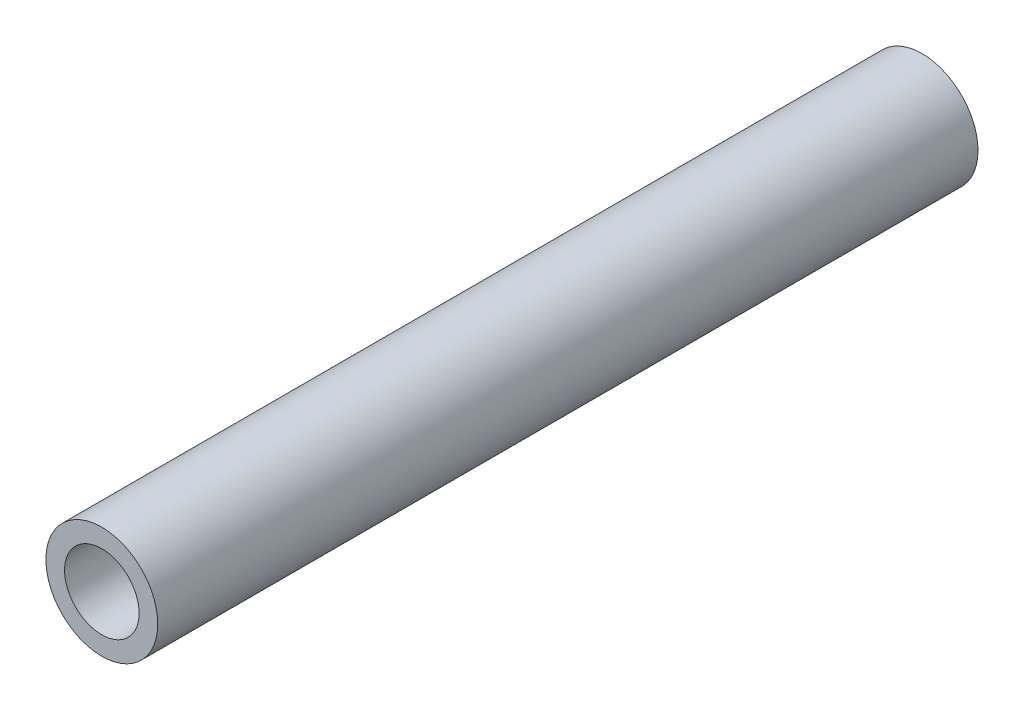
ISO-10303-21;
HEADER;
FILE_DESCRIPTION(('STEP AP214'),'2;1');
FILE_NAME('part.step','',(''),(''),'','','');
FILE_SCHEMA(('AUTOMOTIVE_DESIGN { 1 0 10303 214 1 1 1 1 }'));
ENDSEC;
DATA;
#1=APPLICATION_CONTEXT('core data for automotive mechanical design processes');
#2=APPLICATION_PROTOCOL_DEFINITION('international standard','automotive_design',2000,#1);
#3=PRODUCT_CONTEXT('',#1,'mechanical');
#4=PRODUCT('Part','Part','',(#3));
#5=PRODUCT_RELATED_PRODUCT_CATEGORY('part','',(#4));
#6=PRODUCT_DEFINITION_FORMATION('','',#4);
#7=PRODUCT_DEFINITION_CONTEXT('part definition',#1,'design');
#8=PRODUCT_DEFINITION('design','',#6,#7);
#9=PRODUCT_DEFINITION_SHAPE('','',#8);
#10=(LENGTH_UNIT() NAMED_UNIT(*) SI_UNIT(.MILLI.,.METRE.));
#11=(NAMED_UNIT(*) PLANE_ANGLE_UNIT() SI_UNIT($,.RADIAN.));
#12=(NAMED_UNIT(*) SI_UNIT($,.STERADIAN.) SOLID_ANGLE_UNIT());
#13=UNCERTAINTY_MEASURE_WITH_UNIT(LENGTH_MEASURE(1.E-05),#10,'distance_accuracy_value','');
#14=(GEOMETRIC_REPRESENTATION_CONTEXT(3) GLOBAL_UNCERTAINTY_ASSIGNED_CONTEXT((#13)) GLOBAL_UNIT_ASSIGNED_CONTEXT((#10,
#11,#12)) REPRESENTATION_CONTEXT('',''));
#15=CARTESIAN_POINT('',(0.,0.,0.));
#16=DIRECTION('',(0.,0.,1.));
#17=DIRECTION('',(1.,0.,0.));
#18=AXIS2_PLACEMENT_3D('',#15,#16,#17);
#19=CARTESIAN_POINT('',(0.,0.,44.));
#20=DIRECTION('',(0.,0.,1.));
#21=DIRECTION('',(1.,0.,0.));
#22=AXIS2_PLACEMENT_3D('',#19,#20,#21);
#23=PLANE('',#22);
#24=CARTESIAN_POINT('',(0.,0.,44.));
#25=DIRECTION('',(0.,0.,1.));
#26=DIRECTION('',(1.,0.,0.));
#27=AXIS2_PLACEMENT_3D('',#24,#25,#26);
#28=CIRCLE('',#27,3.);
#29=CARTESIAN_POINT('',(3.,0.,44.));
#30=VERTEX_POINT('',#29);
#31=EDGE_CURVE('E10',#30,#30,#28,.T.);
#32=ORIENTED_EDGE('',*,*,#31,.T.);
#33=EDGE_LOOP('',(#32));
#34=FACE_BOUND('',#33,.T.);
#35=CARTESIAN_POINT('',(0.,0.,44.));
#36=DIRECTION('',(0.,0.,1.));
#37=DIRECTION('',(1.,0.,0.));
#38=AXIS2_PLACEMENT_3D('',#35,#36,#37);
#39=CIRCLE('',#38,2.);
#40=CARTESIAN_POINT('',(2.,0.,44.));
#41=VERTEX_POINT('',#40);
#42=EDGE_CURVE('E43',#41,#41,#39,.T.);
#43=ORIENTED_EDGE('',*,*,#42,.F.);
#44=EDGE_LOOP('',(#43));
#45=FACE_BOUND('',#44,.T.);
#46=ADVANCED_FACE('F32',(#34,#45),#23,.T.);
#47=CARTESIAN_POINT('',(0.,0.,0.));
#48=DIRECTION('',(0.,0.,1.));
#49=DIRECTION('',(1.,0.,0.));
#50=AXIS2_PLACEMENT_3D('',#47,#48,#49);
#51=PLANE('',#50);
#52=CARTESIAN_POINT('',(0.,0.,0.));
#53=DIRECTION('',(0.,0.,1.));
#54=DIRECTION('',(1.,0.,0.));
#55=AXIS2_PLACEMENT_3D('',#52,#53,#54);
#56=CIRCLE('',#55,3.);
#57=CARTESIAN_POINT('',(3.,0.,0.));
#58=VERTEX_POINT('',#57);
#59=EDGE_CURVE('E36',#58,#58,#56,.T.);
#60=ORIENTED_EDGE('',*,*,#59,.F.);
#61=EDGE_LOOP('',(#60));
#62=FACE_BOUND('',#61,.T.);
#63=CARTESIAN_POINT('',(0.,0.,0.));
#64=DIRECTION('',(0.,0.,1.));
#65=DIRECTION('',(1.,0.,0.));
#66=AXIS2_PLACEMENT_3D('',#63,#64,#65);
#67=CIRCLE('',#66,2.);
#68=CARTESIAN_POINT('',(2.,0.,0.));
#69=VERTEX_POINT('',#68);
#70=EDGE_CURVE('E45',#69,#69,#67,.T.);
#71=ORIENTED_EDGE('',*,*,#70,.T.);
#72=EDGE_LOOP('',(#71));
#73=FACE_BOUND('',#72,.T.);
#74=ADVANCED_FACE('F55',(#62,#73),#51,.F.);
#75=CARTESIAN_POINT('',(0.,0.,44.));
#76=DIRECTION('',(0.,0.,-1.));
#77=DIRECTION('',(-1.,0.,0.));
#78=AXIS2_PLACEMENT_3D('',#75,#76,#77);
#79=CYLINDRICAL_SURFACE('',#78,3.);
#80=ORIENTED_EDGE('',*,*,#31,.F.);
#81=EDGE_LOOP('',(#80));
#82=FACE_BOUND('',#81,.T.);
#83=ORIENTED_EDGE('',*,*,#59,.T.);
#84=EDGE_LOOP('',(#83));
#85=FACE_BOUND('',#84,.T.);
#86=ADVANCED_FACE('F34',(#82,#85),#79,.T.);
#87=CARTESIAN_POINT('',(0.,0.,44.));
#88=DIRECTION('',(0.,0.,-1.));
#89=DIRECTION('',(-1.,0.,0.));
#90=AXIS2_PLACEMENT_3D('',#87,#88,#89);
#91=CYLINDRICAL_SURFACE('',#90,2.);
#92=ORIENTED_EDGE('',*,*,#42,.T.);
#93=EDGE_LOOP('',(#92));
#94=FACE_BOUND('',#93,.T.);
#95=ORIENTED_EDGE('',*,*,#70,.F.);
#96=EDGE_LOOP('',(#95));
#97=FACE_BOUND('',#96,.T.);
#98=ADVANCED_FACE('F51',(#94,#97),#91,.F.);
#99=CLOSED_SHELL('',(#46,#74,#86,#98));
#100=MANIFOLD_SOLID_BREP('B2',#99);
#101=ADVANCED_BREP_SHAPE_REPRESENTATION('',(#18,#100),#14);
#102=SHAPE_DEFINITION_REPRESENTATION(#9,#101);
ENDSEC;
END-ISO-10303-21;
